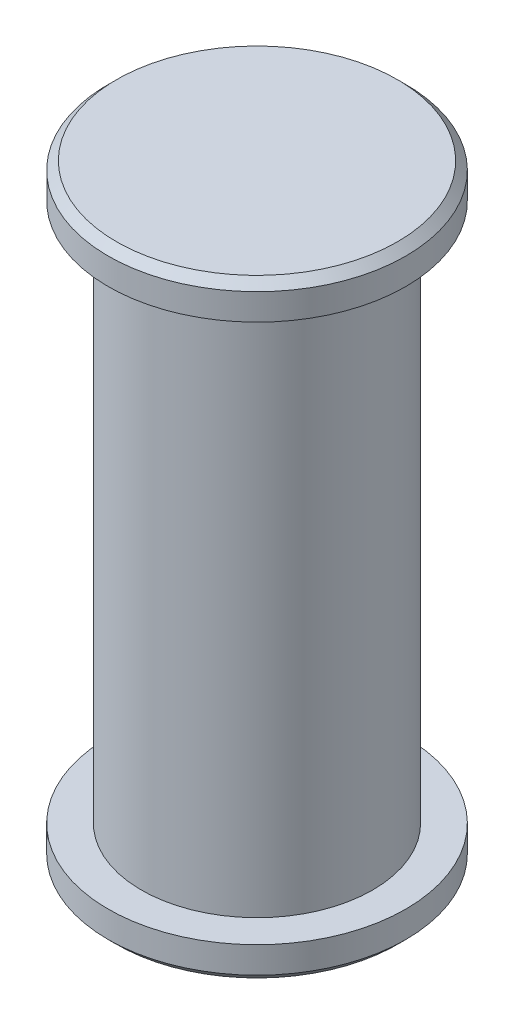
ISO-10303-21;
HEADER;
FILE_DESCRIPTION(('STEP AP214'),'2;1');
FILE_NAME('part.step','',(''),(''),'','','');
FILE_SCHEMA(('AUTOMOTIVE_DESIGN { 1 0 10303 214 1 1 1 1 }'));
ENDSEC;
DATA;
#1=APPLICATION_CONTEXT('core data for automotive mechanical design processes');
#2=APPLICATION_PROTOCOL_DEFINITION('international standard','automotive_design',2000,#1);
#3=PRODUCT_CONTEXT('',#1,'mechanical');
#4=PRODUCT('Part','Part','',(#3));
#5=PRODUCT_RELATED_PRODUCT_CATEGORY('part','',(#4));
#6=PRODUCT_DEFINITION_FORMATION('','',#4);
#7=PRODUCT_DEFINITION_CONTEXT('part definition',#1,'design');
#8=PRODUCT_DEFINITION('design','',#6,#7);
#9=PRODUCT_DEFINITION_SHAPE('','',#8);
#10=(LENGTH_UNIT() NAMED_UNIT(*) SI_UNIT(.MILLI.,.METRE.));
#11=(NAMED_UNIT(*) PLANE_ANGLE_UNIT() SI_UNIT($,.RADIAN.));
#12=(NAMED_UNIT(*) SI_UNIT($,.STERADIAN.) SOLID_ANGLE_UNIT());
#13=UNCERTAINTY_MEASURE_WITH_UNIT(LENGTH_MEASURE(1.E-05),#10,'distance_accuracy_value','');
#14=(GEOMETRIC_REPRESENTATION_CONTEXT(3) GLOBAL_UNCERTAINTY_ASSIGNED_CONTEXT((#13)) GLOBAL_UNIT_ASSIGNED_CONTEXT((#10,
#11,#12)) REPRESENTATION_CONTEXT('',''));
#15=CARTESIAN_POINT('',(0.,0.,0.));
#16=DIRECTION('',(0.,0.,1.));
#17=DIRECTION('',(1.,0.,0.));
#18=AXIS2_PLACEMENT_3D('',#15,#16,#17);
#19=CARTESIAN_POINT('',(0.,18.4078264867778,0.));
#20=DIRECTION('',(0.,-1.,0.));
#21=DIRECTION('',(1.,0.,0.));
#22=AXIS2_PLACEMENT_3D('',#19,#20,#21);
#23=PLANE('',#22);
#24=CARTESIAN_POINT('',(0.,18.4078264867778,0.));
#25=DIRECTION('',(0.,-1.,0.));
#26=DIRECTION('',(1.,0.,0.));
#27=AXIS2_PLACEMENT_3D('',#24,#25,#26);
#28=CIRCLE('',#27,4.25);
#29=CARTESIAN_POINT('',(4.25,18.4078264867778,0.));
#30=VERTEX_POINT('',#29);
#31=EDGE_CURVE('E10',#30,#30,#28,.F.);
#32=ORIENTED_EDGE('',*,*,#31,.T.);
#33=EDGE_LOOP('',(#32));
#34=FACE_BOUND('',#33,.T.);
#35=ADVANCED_FACE('F35',(#34),#23,.F.);
#36=CARTESIAN_POINT('',(0.,0.,0.));
#37=DIRECTION('',(0.,-1.,0.));
#38=DIRECTION('',(1.,0.,0.));
#39=AXIS2_PLACEMENT_3D('',#36,#37,#38);
#40=CYLINDRICAL_SURFACE('',#39,4.5);
#41=CARTESIAN_POINT('',(0.,18.1578264867778,0.));
#42=DIRECTION('',(0.,-1.,0.));
#43=DIRECTION('',(1.,0.,0.));
#44=AXIS2_PLACEMENT_3D('',#41,#42,#43);
#45=CIRCLE('',#44,4.5);
#46=CARTESIAN_POINT('',(4.5,18.1578264867778,0.));
#47=VERTEX_POINT('',#46);
#48=EDGE_CURVE('E42',#47,#47,#45,.T.);
#49=ORIENTED_EDGE('',*,*,#48,.T.);
#50=EDGE_LOOP('',(#49));
#51=FACE_BOUND('',#50,.T.);
#52=CARTESIAN_POINT('',(0.,17.3589132433889,0.));
#53=DIRECTION('',(0.,-1.,0.));
#54=DIRECTION('',(1.,0.,0.));
#55=AXIS2_PLACEMENT_3D('',#52,#53,#54);
#56=CIRCLE('',#55,4.5);
#57=CARTESIAN_POINT('',(4.5,17.3589132433889,0.));
#58=VERTEX_POINT('',#57);
#59=EDGE_CURVE('E55',#58,#58,#56,.T.);
#60=ORIENTED_EDGE('',*,*,#59,.F.);
#61=EDGE_LOOP('',(#60));
#62=FACE_BOUND('',#61,.T.);
#63=ADVANCED_FACE('F85',(#51,#62),#40,.T.);
#64=CARTESIAN_POINT('',(-4.5,17.3589132433889,0.));
#65=DIRECTION('',(0.,1.,0.));
#66=DIRECTION('',(-1.,0.,0.));
#67=AXIS2_PLACEMENT_3D('',#64,#65,#66);
#68=PLANE('',#67);
#69=CARTESIAN_POINT('',(0.,17.3589132433889,0.));
#70=DIRECTION('',(0.,-1.,0.));
#71=DIRECTION('',(1.,0.,0.));
#72=AXIS2_PLACEMENT_3D('',#69,#70,#71);
#73=CIRCLE('',#72,3.5);
#74=CARTESIAN_POINT('',(3.5,17.3589132433889,0.));
#75=VERTEX_POINT('',#74);
#76=EDGE_CURVE('E58',#75,#75,#73,.T.);
#77=ORIENTED_EDGE('',*,*,#76,.F.);
#78=EDGE_LOOP('',(#77));
#79=FACE_BOUND('',#78,.T.);
#80=ORIENTED_EDGE('',*,*,#59,.T.);
#81=EDGE_LOOP('',(#80));
#82=FACE_BOUND('',#81,.T.);
#83=ADVANCED_FACE('F79',(#79,#82),#68,.F.);
#84=CARTESIAN_POINT('',(0.,0.,0.));
#85=DIRECTION('',(0.,-1.,0.));
#86=DIRECTION('',(1.,0.,0.));
#87=AXIS2_PLACEMENT_3D('',#84,#85,#86);
#88=CYLINDRICAL_SURFACE('',#87,3.5);
#89=CARTESIAN_POINT('',(0.,1.04891324338891,0.));
#90=DIRECTION('',(0.,-1.,0.));
#91=DIRECTION('',(1.,0.,0.));
#92=AXIS2_PLACEMENT_3D('',#89,#90,#91);
#93=CIRCLE('',#92,3.5);
#94=CARTESIAN_POINT('',(3.5,1.04891324338891,0.));
#95=VERTEX_POINT('',#94);
#96=EDGE_CURVE('E61',#95,#95,#93,.T.);
#97=ORIENTED_EDGE('',*,*,#96,.F.);
#98=EDGE_LOOP('',(#97));
#99=FACE_BOUND('',#98,.T.);
#100=ORIENTED_EDGE('',*,*,#76,.T.);
#101=EDGE_LOOP('',(#100));
#102=FACE_BOUND('',#101,.T.);
#103=ADVANCED_FACE('F73',(#99,#102),#88,.T.);
#104=CARTESIAN_POINT('',(-3.5,1.04891324338891,0.));
#105=DIRECTION('',(0.,-1.,0.));
#106=DIRECTION('',(1.,0.,0.));
#107=AXIS2_PLACEMENT_3D('',#104,#105,#106);
#108=PLANE('',#107);
#109=CARTESIAN_POINT('',(0.,1.04891324338891,0.));
#110=DIRECTION('',(0.,-1.,0.));
#111=DIRECTION('',(1.,0.,0.));
#112=AXIS2_PLACEMENT_3D('',#109,#110,#111);
#113=CIRCLE('',#112,4.5);
#114=CARTESIAN_POINT('',(4.5,1.04891324338891,0.));
#115=VERTEX_POINT('',#114);
#116=EDGE_CURVE('E64',#115,#115,#113,.T.);
#117=ORIENTED_EDGE('',*,*,#116,.F.);
#118=EDGE_LOOP('',(#117));
#119=FACE_BOUND('',#118,.T.);
#120=ORIENTED_EDGE('',*,*,#96,.T.);
#121=EDGE_LOOP('',(#120));
#122=FACE_BOUND('',#121,.T.);
#123=ADVANCED_FACE('F70',(#119,#122),#108,.F.);
#124=CARTESIAN_POINT('',(0.,0.,0.));
#125=DIRECTION('',(0.,-1.,0.));
#126=DIRECTION('',(1.,0.,0.));
#127=AXIS2_PLACEMENT_3D('',#124,#125,#126);
#128=CYLINDRICAL_SURFACE('',#127,4.5);
#129=CARTESIAN_POINT('',(0.,0.249999999999997,0.));
#130=DIRECTION('',(0.,1.,0.));
#131=DIRECTION('',(-1.,0.,0.));
#132=AXIS2_PLACEMENT_3D('',#129,#130,#131);
#133=CIRCLE('',#132,4.5);
#134=CARTESIAN_POINT('',(-4.5,0.249999999999997,0.));
#135=VERTEX_POINT('',#134);
#136=EDGE_CURVE('E46',#135,#135,#133,.T.);
#137=ORIENTED_EDGE('',*,*,#136,.T.);
#138=EDGE_LOOP('',(#137));
#139=FACE_BOUND('',#138,.T.);
#140=ORIENTED_EDGE('',*,*,#116,.T.);
#141=EDGE_LOOP('',(#140));
#142=FACE_BOUND('',#141,.T.);
#143=ADVANCED_FACE('F68',(#139,#142),#128,.T.);
#144=CARTESIAN_POINT('',(-4.5,0.,0.));
#145=DIRECTION('',(0.,1.,0.));
#146=DIRECTION('',(-1.,0.,0.));
#147=AXIS2_PLACEMENT_3D('',#144,#145,#146);
#148=PLANE('',#147);
#149=CARTESIAN_POINT('',(0.,0.,0.));
#150=DIRECTION('',(0.,1.,0.));
#151=DIRECTION('',(-1.,0.,0.));
#152=AXIS2_PLACEMENT_3D('',#149,#150,#151);
#153=CIRCLE('',#152,4.25000000000001);
#154=CARTESIAN_POINT('',(-4.25000000000001,0.,0.));
#155=VERTEX_POINT('',#154);
#156=EDGE_CURVE('E50',#155,#155,#153,.F.);
#157=ORIENTED_EDGE('',*,*,#156,.T.);
#158=EDGE_LOOP('',(#157));
#159=FACE_BOUND('',#158,.T.);
#160=ADVANCED_FACE('F98',(#159),#148,.F.);
#161=CARTESIAN_POINT('',(0.,0.,0.));
#162=DIRECTION('',(0.,1.,0.));
#163=DIRECTION('',(-1.,0.,0.));
#164=AXIS2_PLACEMENT_3D('',#161,#162,#163);
#165=CONICAL_SURFACE('',#164,4.25000000000001,0.785398163397445);
#166=ORIENTED_EDGE('',*,*,#136,.F.);
#167=EDGE_LOOP('',(#166));
#168=FACE_BOUND('',#167,.T.);
#169=ORIENTED_EDGE('',*,*,#156,.F.);
#170=EDGE_LOOP('',(#169));
#171=FACE_BOUND('',#170,.T.);
#172=ADVANCED_FACE('F96',(#168,#171),#165,.T.);
#173=CARTESIAN_POINT('',(0.,18.1578264867778,0.));
#174=DIRECTION('',(0.,-1.,0.));
#175=DIRECTION('',(1.,0.,0.));
#176=AXIS2_PLACEMENT_3D('',#173,#174,#175);
#177=CONICAL_SURFACE('',#176,4.5,0.785398163397448);
#178=ORIENTED_EDGE('',*,*,#31,.F.);
#179=EDGE_LOOP('',(#178));
#180=FACE_BOUND('',#179,.T.);
#181=ORIENTED_EDGE('',*,*,#48,.F.);
#182=EDGE_LOOP('',(#181));
#183=FACE_BOUND('',#182,.T.);
#184=ADVANCED_FACE('F37',(#180,#183),#177,.T.);
#185=CLOSED_SHELL('',(#35,#63,#83,#103,#123,#143,#160,#172,#184));
#186=MANIFOLD_SOLID_BREP('B2',#185);
#187=ADVANCED_BREP_SHAPE_REPRESENTATION('',(#18,#186),#14);
#188=SHAPE_DEFINITION_REPRESENTATION(#9,#187);
ENDSEC;
END-ISO-10303-21;
